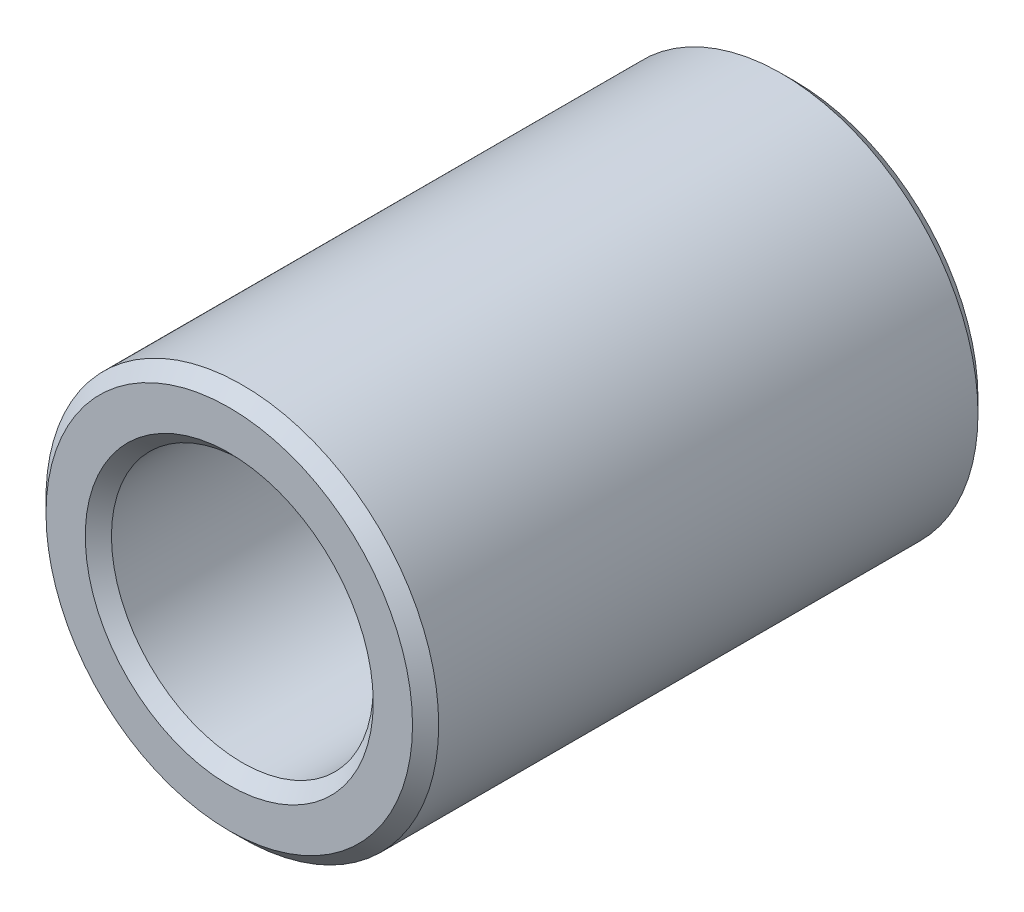
ISO-10303-21;
HEADER;
FILE_DESCRIPTION(('STEP AP214'),'2;1');
FILE_NAME('part.step','',(''),(''),'','','');
FILE_SCHEMA(('AUTOMOTIVE_DESIGN { 1 0 10303 214 1 1 1 1 }'));
ENDSEC;
DATA;
#1=APPLICATION_CONTEXT('core data for automotive mechanical design processes');
#2=APPLICATION_PROTOCOL_DEFINITION('international standard','automotive_design',2000,#1);
#3=PRODUCT_CONTEXT('',#1,'mechanical');
#4=PRODUCT('Part','Part','',(#3));
#5=PRODUCT_RELATED_PRODUCT_CATEGORY('part','',(#4));
#6=PRODUCT_DEFINITION_FORMATION('','',#4);
#7=PRODUCT_DEFINITION_CONTEXT('part definition',#1,'design');
#8=PRODUCT_DEFINITION('design','',#6,#7);
#9=PRODUCT_DEFINITION_SHAPE('','',#8);
#10=(LENGTH_UNIT() NAMED_UNIT(*) SI_UNIT(.MILLI.,.METRE.));
#11=(NAMED_UNIT(*) PLANE_ANGLE_UNIT() SI_UNIT($,.RADIAN.));
#12=(NAMED_UNIT(*) SI_UNIT($,.STERADIAN.) SOLID_ANGLE_UNIT());
#13=UNCERTAINTY_MEASURE_WITH_UNIT(LENGTH_MEASURE(1.E-05),#10,'distance_accuracy_value','');
#14=(GEOMETRIC_REPRESENTATION_CONTEXT(3) GLOBAL_UNCERTAINTY_ASSIGNED_CONTEXT((#13)) GLOBAL_UNIT_ASSIGNED_CONTEXT((#10,
#11,#12)) REPRESENTATION_CONTEXT('',''));
#15=CARTESIAN_POINT('',(0.,0.,0.));
#16=DIRECTION('',(0.,0.,1.));
#17=DIRECTION('',(1.,0.,0.));
#18=AXIS2_PLACEMENT_3D('',#15,#16,#17);
#19=CARTESIAN_POINT('',(0.,0.,4.32));
#20=DIRECTION('',(0.,0.,1.));
#21=DIRECTION('',(1.,0.,0.));
#22=AXIS2_PLACEMENT_3D('',#19,#20,#21);
#23=PLANE('',#22);
#24=CARTESIAN_POINT('',(0.,0.,4.32));
#25=DIRECTION('',(0.,0.,1.));
#26=DIRECTION('',(1.,0.,0.));
#27=AXIS2_PLACEMENT_3D('',#24,#25,#26);
#28=CIRCLE('',#27,1.1);
#29=CARTESIAN_POINT('',(1.1,0.,4.32));
#30=VERTEX_POINT('',#29);
#31=EDGE_CURVE('E10',#30,#30,#28,.F.);
#32=ORIENTED_EDGE('',*,*,#31,.T.);
#33=EDGE_LOOP('',(#32));
#34=FACE_BOUND('',#33,.T.);
#35=CARTESIAN_POINT('',(0.,0.,4.32));
#36=DIRECTION('',(0.,0.,1.));
#37=DIRECTION('',(1.,0.,0.));
#38=AXIS2_PLACEMENT_3D('',#35,#36,#37);
#39=CIRCLE('',#38,1.4);
#40=CARTESIAN_POINT('',(1.4,0.,4.32));
#41=VERTEX_POINT('',#40);
#42=EDGE_CURVE('E38',#41,#41,#39,.T.);
#43=ORIENTED_EDGE('',*,*,#42,.T.);
#44=EDGE_LOOP('',(#43));
#45=FACE_BOUND('',#44,.T.);
#46=ADVANCED_FACE('F31',(#34,#45),#23,.T.);
#47=CARTESIAN_POINT('',(0.,0.,0.));
#48=DIRECTION('',(0.,0.,1.));
#49=DIRECTION('',(1.,0.,0.));
#50=AXIS2_PLACEMENT_3D('',#47,#48,#49);
#51=PLANE('',#50);
#52=CARTESIAN_POINT('',(0.,0.,0.));
#53=DIRECTION('',(0.,0.,1.));
#54=DIRECTION('',(1.,0.,0.));
#55=AXIS2_PLACEMENT_3D('',#52,#53,#54);
#56=CIRCLE('',#55,1.1);
#57=CARTESIAN_POINT('',(1.1,0.,0.));
#58=VERTEX_POINT('',#57);
#59=EDGE_CURVE('E57',#58,#58,#56,.T.);
#60=ORIENTED_EDGE('',*,*,#59,.T.);
#61=EDGE_LOOP('',(#60));
#62=FACE_BOUND('',#61,.T.);
#63=CARTESIAN_POINT('',(0.,0.,0.));
#64=DIRECTION('',(0.,0.,1.));
#65=DIRECTION('',(1.,0.,0.));
#66=AXIS2_PLACEMENT_3D('',#63,#64,#65);
#67=CIRCLE('',#66,1.4);
#68=CARTESIAN_POINT('',(1.4,0.,0.));
#69=VERTEX_POINT('',#68);
#70=EDGE_CURVE('E60',#69,#69,#67,.F.);
#71=ORIENTED_EDGE('',*,*,#70,.T.);
#72=EDGE_LOOP('',(#71));
#73=FACE_BOUND('',#72,.T.);
#74=ADVANCED_FACE('F64',(#62,#73),#51,.F.);
#75=CARTESIAN_POINT('',(0.,0.,4.32));
#76=DIRECTION('',(0.,0.,-1.));
#77=DIRECTION('',(-1.,0.,0.));
#78=AXIS2_PLACEMENT_3D('',#75,#76,#77);
#79=CYLINDRICAL_SURFACE('',#78,1.5);
#80=CARTESIAN_POINT('',(0.,0.,0.1));
#81=DIRECTION('',(0.,0.,1.));
#82=DIRECTION('',(1.,0.,0.));
#83=AXIS2_PLACEMENT_3D('',#80,#81,#82);
#84=CIRCLE('',#83,1.5);
#85=CARTESIAN_POINT('',(1.5,0.,0.1));
#86=VERTEX_POINT('',#85);
#87=EDGE_CURVE('E42',#86,#86,#84,.T.);
#88=ORIENTED_EDGE('',*,*,#87,.T.);
#89=EDGE_LOOP('',(#88));
#90=FACE_BOUND('',#89,.T.);
#91=CARTESIAN_POINT('',(0.,0.,4.22));
#92=DIRECTION('',(0.,0.,1.));
#93=DIRECTION('',(1.,0.,0.));
#94=AXIS2_PLACEMENT_3D('',#91,#92,#93);
#95=CIRCLE('',#94,1.5);
#96=CARTESIAN_POINT('',(1.5,0.,4.22));
#97=VERTEX_POINT('',#96);
#98=EDGE_CURVE('E46',#97,#97,#95,.F.);
#99=ORIENTED_EDGE('',*,*,#98,.T.);
#100=EDGE_LOOP('',(#99));
#101=FACE_BOUND('',#100,.T.);
#102=ADVANCED_FACE('F74',(#90,#101),#79,.T.);
#103=CARTESIAN_POINT('',(0.,0.,4.32));
#104=DIRECTION('',(0.,0.,-1.));
#105=DIRECTION('',(-1.,0.,0.));
#106=AXIS2_PLACEMENT_3D('',#103,#104,#105);
#107=CYLINDRICAL_SURFACE('',#106,1.);
#108=CARTESIAN_POINT('',(0.,0.,0.100000000000001));
#109=DIRECTION('',(0.,0.,1.));
#110=DIRECTION('',(1.,0.,0.));
#111=AXIS2_PLACEMENT_3D('',#108,#109,#110);
#112=CIRCLE('',#111,1.);
#113=CARTESIAN_POINT('',(1.,0.,0.100000000000001));
#114=VERTEX_POINT('',#113);
#115=EDGE_CURVE('E51',#114,#114,#112,.F.);
#116=ORIENTED_EDGE('',*,*,#115,.T.);
#117=EDGE_LOOP('',(#116));
#118=FACE_BOUND('',#117,.T.);
#119=CARTESIAN_POINT('',(0.,0.,4.22));
#120=DIRECTION('',(0.,0.,1.));
#121=DIRECTION('',(1.,0.,0.));
#122=AXIS2_PLACEMENT_3D('',#119,#120,#121);
#123=CIRCLE('',#122,1.);
#124=CARTESIAN_POINT('',(1.,0.,4.22));
#125=VERTEX_POINT('',#124);
#126=EDGE_CURVE('E54',#125,#125,#123,.T.);
#127=ORIENTED_EDGE('',*,*,#126,.T.);
#128=EDGE_LOOP('',(#127));
#129=FACE_BOUND('',#128,.T.);
#130=ADVANCED_FACE('F77',(#118,#129),#107,.F.);
#131=CARTESIAN_POINT('',(0.,0.,0.));
#132=DIRECTION('',(0.,0.,-1.));
#133=DIRECTION('',(-1.,0.,0.));
#134=AXIS2_PLACEMENT_3D('',#131,#132,#133);
#135=CONICAL_SURFACE('',#134,1.1,0.785398163397446);
#136=ORIENTED_EDGE('',*,*,#115,.F.);
#137=EDGE_LOOP('',(#136));
#138=FACE_BOUND('',#137,.T.);
#139=ORIENTED_EDGE('',*,*,#59,.F.);
#140=EDGE_LOOP('',(#139));
#141=FACE_BOUND('',#140,.T.);
#142=ADVANCED_FACE('F70',(#138,#141),#135,.F.);
#143=CARTESIAN_POINT('',(0.,0.,0.1));
#144=DIRECTION('',(0.,0.,1.));
#145=DIRECTION('',(1.,0.,0.));
#146=AXIS2_PLACEMENT_3D('',#143,#144,#145);
#147=CONICAL_SURFACE('',#146,1.5,0.78539816339745);
#148=ORIENTED_EDGE('',*,*,#70,.F.);
#149=EDGE_LOOP('',(#148));
#150=FACE_BOUND('',#149,.T.);
#151=ORIENTED_EDGE('',*,*,#87,.F.);
#152=EDGE_LOOP('',(#151));
#153=FACE_BOUND('',#152,.T.);
#154=ADVANCED_FACE('F66',(#150,#153),#147,.T.);
#155=CARTESIAN_POINT('',(0.,0.,4.22));
#156=DIRECTION('',(0.,0.,1.));
#157=DIRECTION('',(1.,0.,0.));
#158=AXIS2_PLACEMENT_3D('',#155,#156,#157);
#159=CONICAL_SURFACE('',#158,1.,0.785398163397448);
#160=ORIENTED_EDGE('',*,*,#31,.F.);
#161=EDGE_LOOP('',(#160));
#162=FACE_BOUND('',#161,.T.);
#163=ORIENTED_EDGE('',*,*,#126,.F.);
#164=EDGE_LOOP('',(#163));
#165=FACE_BOUND('',#164,.T.);
#166=ADVANCED_FACE('F69',(#162,#165),#159,.F.);
#167=CARTESIAN_POINT('',(0.,0.,4.32));
#168=DIRECTION('',(0.,0.,-1.));
#169=DIRECTION('',(-1.,0.,0.));
#170=AXIS2_PLACEMENT_3D('',#167,#168,#169);
#171=CONICAL_SURFACE('',#170,1.4,0.78539816339744);
#172=ORIENTED_EDGE('',*,*,#98,.F.);
#173=EDGE_LOOP('',(#172));
#174=FACE_BOUND('',#173,.T.);
#175=ORIENTED_EDGE('',*,*,#42,.F.);
#176=EDGE_LOOP('',(#175));
#177=FACE_BOUND('',#176,.T.);
#178=ADVANCED_FACE('F33',(#174,#177),#171,.T.);
#179=CLOSED_SHELL('',(#46,#74,#102,#130,#142,#154,#166,#178));
#180=MANIFOLD_SOLID_BREP('B2',#179);
#181=ADVANCED_BREP_SHAPE_REPRESENTATION('',(#18,#180),#14);
#182=SHAPE_DEFINITION_REPRESENTATION(#9,#181);
ENDSEC;
END-ISO-10303-21;
